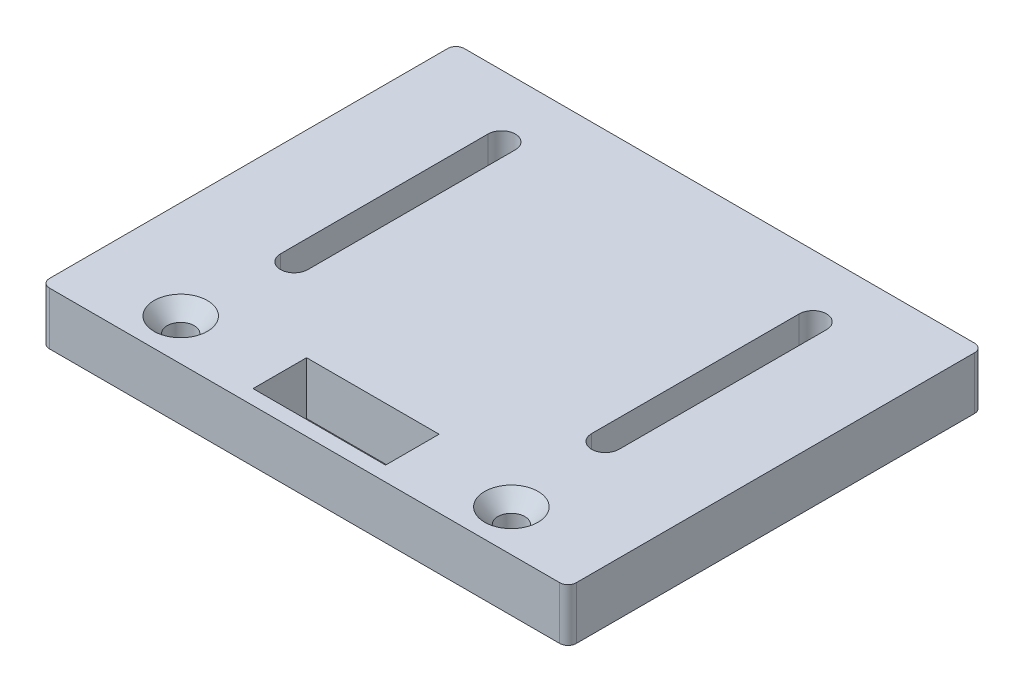
ISO-10303-21;
HEADER;
FILE_DESCRIPTION(('STEP AP214'),'2;1');
FILE_NAME('part.step','',(''),(''),'','','');
FILE_SCHEMA(('AUTOMOTIVE_DESIGN { 1 0 10303 214 1 1 1 1 }'));
ENDSEC;
DATA;
#1=APPLICATION_CONTEXT('core data for automotive mechanical design processes');
#2=APPLICATION_PROTOCOL_DEFINITION('international standard','automotive_design',2000,#1);
#3=PRODUCT_CONTEXT('',#1,'mechanical');
#4=PRODUCT('Part','Part','',(#3));
#5=PRODUCT_RELATED_PRODUCT_CATEGORY('part','',(#4));
#6=PRODUCT_DEFINITION_FORMATION('','',#4);
#7=PRODUCT_DEFINITION_CONTEXT('part definition',#1,'design');
#8=PRODUCT_DEFINITION('design','',#6,#7);
#9=PRODUCT_DEFINITION_SHAPE('','',#8);
#10=(LENGTH_UNIT() NAMED_UNIT(*) SI_UNIT(.MILLI.,.METRE.));
#11=(NAMED_UNIT(*) PLANE_ANGLE_UNIT() SI_UNIT($,.RADIAN.));
#12=(NAMED_UNIT(*) SI_UNIT($,.STERADIAN.) SOLID_ANGLE_UNIT());
#13=UNCERTAINTY_MEASURE_WITH_UNIT(LENGTH_MEASURE(1.E-05),#10,'distance_accuracy_value','');
#14=(GEOMETRIC_REPRESENTATION_CONTEXT(3) GLOBAL_UNCERTAINTY_ASSIGNED_CONTEXT((#13)) GLOBAL_UNIT_ASSIGNED_CONTEXT((#10,
#11,#12)) REPRESENTATION_CONTEXT('',''));
#15=CARTESIAN_POINT('',(0.,0.,0.));
#16=DIRECTION('',(0.,0.,1.));
#17=DIRECTION('',(1.,0.,0.));
#18=AXIS2_PLACEMENT_3D('',#15,#16,#17);
#19=CARTESIAN_POINT('',(0.,12.7,0.));
#20=DIRECTION('',(1.,0.,0.));
#21=DIRECTION('',(0.,0.,-1.));
#22=AXIS2_PLACEMENT_3D('',#19,#20,#21);
#23=PLANE('',#22);
#24=DIRECTION('',(0.,0.,1.));
#25=VECTOR('',#24,1.);
#26=CARTESIAN_POINT('',(0.,0.,0.));
#27=LINE('',#26,#25);
#28=CARTESIAN_POINT('',(0.,0.,-98.));
#29=VERTEX_POINT('',#28);
#30=CARTESIAN_POINT('',(0.,0.,-2.));
#31=VERTEX_POINT('',#30);
#32=EDGE_CURVE('E275',#29,#31,#27,.T.);
#33=ORIENTED_EDGE('',*,*,#32,.T.);
#34=DIRECTION('',(0.,-1.,0.));
#35=VECTOR('',#34,1.);
#36=CARTESIAN_POINT('',(0.,12.7,-2.));
#37=LINE('',#36,#35);
#38=CARTESIAN_POINT('',(0.,12.7,-2.));
#39=VERTEX_POINT('',#38);
#40=EDGE_CURVE('E11',#31,#39,#37,.F.);
#41=ORIENTED_EDGE('',*,*,#40,.T.);
#42=DIRECTION('',(0.,0.,1.));
#43=VECTOR('',#42,1.);
#44=CARTESIAN_POINT('',(0.,12.7,0.));
#45=LINE('',#44,#43);
#46=CARTESIAN_POINT('',(0.,12.7,-98.));
#47=VERTEX_POINT('',#46);
#48=EDGE_CURVE('E281',#47,#39,#45,.T.);
#49=ORIENTED_EDGE('',*,*,#48,.F.);
#50=DIRECTION('',(0.,-1.,0.));
#51=VECTOR('',#50,1.);
#52=CARTESIAN_POINT('',(0.,12.7,-98.));
#53=LINE('',#52,#51);
#54=EDGE_CURVE('E40',#47,#29,#53,.T.);
#55=ORIENTED_EDGE('',*,*,#54,.T.);
#56=EDGE_LOOP('',(#33,#41,#49,#55));
#57=FACE_BOUND('',#56,.T.);
#58=ADVANCED_FACE('F32',(#57),#23,.F.);
#59=CARTESIAN_POINT('',(0.,12.7,0.));
#60=DIRECTION('',(0.,0.,-1.));
#61=DIRECTION('',(-1.,0.,0.));
#62=AXIS2_PLACEMENT_3D('',#59,#60,#61);
#63=PLANE('',#62);
#64=DIRECTION('',(1.,0.,0.));
#65=VECTOR('',#64,1.);
#66=CARTESIAN_POINT('',(0.,0.,0.));
#67=LINE('',#66,#65);
#68=CARTESIAN_POINT('',(2.,0.,0.));
#69=VERTEX_POINT('',#68);
#70=CARTESIAN_POINT('',(125.,0.,0.));
#71=VERTEX_POINT('',#70);
#72=EDGE_CURVE('E295',#69,#71,#67,.T.);
#73=ORIENTED_EDGE('',*,*,#72,.T.);
#74=DIRECTION('',(0.,-1.,0.));
#75=VECTOR('',#74,1.);
#76=CARTESIAN_POINT('',(125.,12.7,0.));
#77=LINE('',#76,#75);
#78=CARTESIAN_POINT('',(125.,12.7,0.));
#79=VERTEX_POINT('',#78);
#80=EDGE_CURVE('E47',#71,#79,#77,.F.);
#81=ORIENTED_EDGE('',*,*,#80,.T.);
#82=DIRECTION('',(1.,0.,0.));
#83=VECTOR('',#82,1.);
#84=CARTESIAN_POINT('',(0.,12.7,0.));
#85=LINE('',#84,#83);
#86=CARTESIAN_POINT('',(2.,12.7,0.));
#87=VERTEX_POINT('',#86);
#88=EDGE_CURVE('E283',#87,#79,#85,.T.);
#89=ORIENTED_EDGE('',*,*,#88,.F.);
#90=DIRECTION('',(0.,-1.,0.));
#91=VECTOR('',#90,1.);
#92=CARTESIAN_POINT('',(2.,12.7,0.));
#93=LINE('',#92,#91);
#94=EDGE_CURVE('E326',#87,#69,#93,.T.);
#95=ORIENTED_EDGE('',*,*,#94,.T.);
#96=EDGE_LOOP('',(#73,#81,#89,#95));
#97=FACE_BOUND('',#96,.T.);
#98=ADVANCED_FACE('F343',(#97),#63,.F.);
#99=CARTESIAN_POINT('',(127.,12.7,0.));
#100=DIRECTION('',(-1.,0.,0.));
#101=DIRECTION('',(0.,0.,1.));
#102=AXIS2_PLACEMENT_3D('',#99,#100,#101);
#103=PLANE('',#102);
#104=DIRECTION('',(0.,0.,-1.));
#105=VECTOR('',#104,1.);
#106=CARTESIAN_POINT('',(127.,0.,0.));
#107=LINE('',#106,#105);
#108=CARTESIAN_POINT('',(127.,0.,-2.));
#109=VERTEX_POINT('',#108);
#110=CARTESIAN_POINT('',(127.,0.,-98.));
#111=VERTEX_POINT('',#110);
#112=EDGE_CURVE('E297',#109,#111,#107,.T.);
#113=ORIENTED_EDGE('',*,*,#112,.T.);
#114=DIRECTION('',(0.,-1.,0.));
#115=VECTOR('',#114,1.);
#116=CARTESIAN_POINT('',(127.,12.7,-98.));
#117=LINE('',#116,#115);
#118=CARTESIAN_POINT('',(127.,12.7,-98.));
#119=VERTEX_POINT('',#118);
#120=EDGE_CURVE('E317',#111,#119,#117,.F.);
#121=ORIENTED_EDGE('',*,*,#120,.T.);
#122=DIRECTION('',(0.,0.,-1.));
#123=VECTOR('',#122,1.);
#124=CARTESIAN_POINT('',(127.,12.7,0.));
#125=LINE('',#124,#123);
#126=CARTESIAN_POINT('',(127.,12.7,-2.));
#127=VERTEX_POINT('',#126);
#128=EDGE_CURVE('E286',#127,#119,#125,.T.);
#129=ORIENTED_EDGE('',*,*,#128,.F.);
#130=DIRECTION('',(0.,-1.,0.));
#131=VECTOR('',#130,1.);
#132=CARTESIAN_POINT('',(127.,12.7,-2.));
#133=LINE('',#132,#131);
#134=EDGE_CURVE('E314',#127,#109,#133,.T.);
#135=ORIENTED_EDGE('',*,*,#134,.T.);
#136=EDGE_LOOP('',(#113,#121,#129,#135));
#137=FACE_BOUND('',#136,.T.);
#138=ADVANCED_FACE('F352',(#137),#103,.F.);
#139=CARTESIAN_POINT('',(0.,12.7,-100.));
#140=DIRECTION('',(0.,0.,1.));
#141=DIRECTION('',(1.,0.,0.));
#142=AXIS2_PLACEMENT_3D('',#139,#140,#141);
#143=PLANE('',#142);
#144=DIRECTION('',(-1.,0.,0.));
#145=VECTOR('',#144,1.);
#146=CARTESIAN_POINT('',(0.,12.7,-100.));
#147=LINE('',#146,#145);
#148=CARTESIAN_POINT('',(125.,12.7,-100.));
#149=VERTEX_POINT('',#148);
#150=CARTESIAN_POINT('',(2.,12.7,-100.));
#151=VERTEX_POINT('',#150);
#152=EDGE_CURVE('E289',#149,#151,#147,.T.);
#153=ORIENTED_EDGE('',*,*,#152,.F.);
#154=DIRECTION('',(0.,-1.,0.));
#155=VECTOR('',#154,1.);
#156=CARTESIAN_POINT('',(125.,12.7,-100.));
#157=LINE('',#156,#155);
#158=CARTESIAN_POINT('',(125.,0.,-100.));
#159=VERTEX_POINT('',#158);
#160=EDGE_CURVE('E303',#149,#159,#157,.T.);
#161=ORIENTED_EDGE('',*,*,#160,.T.);
#162=DIRECTION('',(-1.,0.,0.));
#163=VECTOR('',#162,1.);
#164=CARTESIAN_POINT('',(0.,0.,-100.));
#165=LINE('',#164,#163);
#166=CARTESIAN_POINT('',(2.,0.,-100.));
#167=VERTEX_POINT('',#166);
#168=EDGE_CURVE('E284',#159,#167,#165,.T.);
#169=ORIENTED_EDGE('',*,*,#168,.T.);
#170=DIRECTION('',(0.,-1.,0.));
#171=VECTOR('',#170,1.);
#172=CARTESIAN_POINT('',(2.,12.7,-100.));
#173=LINE('',#172,#171);
#174=EDGE_CURVE('E292',#167,#151,#173,.F.);
#175=ORIENTED_EDGE('',*,*,#174,.T.);
#176=EDGE_LOOP('',(#153,#161,#169,#175));
#177=FACE_BOUND('',#176,.T.);
#178=ADVANCED_FACE('F360',(#177),#143,.F.);
#179=CARTESIAN_POINT('',(0.,12.7,0.));
#180=DIRECTION('',(0.,-1.,0.));
#181=DIRECTION('',(0.,0.,-1.));
#182=AXIS2_PLACEMENT_3D('',#179,#180,#181);
#183=PLANE('',#182);
#184=CARTESIAN_POINT('',(23.65,12.7,-9.99689239735138));
#185=DIRECTION('',(0.,1.,0.));
#186=DIRECTION('',(0.,0.,1.));
#187=AXIS2_PLACEMENT_3D('',#184,#185,#186);
#188=CIRCLE('',#187,6.4389);
#189=CARTESIAN_POINT('',(23.65,12.7,-3.55799239735138));
#190=VERTEX_POINT('',#189);
#191=EDGE_CURVE('E632',#190,#190,#188,.T.);
#192=ORIENTED_EDGE('',*,*,#191,.F.);
#193=EDGE_LOOP('',(#192));
#194=FACE_BOUND('',#193,.T.);
#195=CARTESIAN_POINT('',(103.35,12.7,-9.99689239735138));
#196=DIRECTION('',(0.,1.,0.));
#197=DIRECTION('',(0.,0.,1.));
#198=AXIS2_PLACEMENT_3D('',#195,#196,#197);
#199=CIRCLE('',#198,6.4389);
#200=CARTESIAN_POINT('',(103.35,12.7,-3.55799239735138));
#201=VERTEX_POINT('',#200);
#202=EDGE_CURVE('E639',#201,#201,#199,.T.);
#203=ORIENTED_EDGE('',*,*,#202,.F.);
#204=EDGE_LOOP('',(#203));
#205=FACE_BOUND('',#204,.T.);
#206=DIRECTION('',(-0.000607902679401196,0.,0.999999815227149));
#207=VECTOR('',#206,1.);
#208=CARTESIAN_POINT('',(97.7212702745475,12.7,-34.9792032613147));
#209=LINE('',#208,#207);
#210=CARTESIAN_POINT('',(97.7516654085176,12.7,-84.9791940226721));
#211=VERTEX_POINT('',#210);
#212=CARTESIAN_POINT('',(97.7212702745475,12.7,-34.9792032613147));
#213=VERTEX_POINT('',#212);
#214=EDGE_CURVE('E207',#211,#213,#209,.T.);
#215=ORIENTED_EDGE('',*,*,#214,.F.);
#216=CARTESIAN_POINT('',(101.051664798767,12.7,-84.9771879438301));
#217=DIRECTION('',(0.,1.,0.));
#218=DIRECTION('',(0.,0.,-1.));
#219=AXIS2_PLACEMENT_3D('',#216,#217,#218);
#220=CIRCLE('',#219,3.3);
#221=CARTESIAN_POINT('',(104.351664189017,12.7,-84.9751818649881));
#222=VERTEX_POINT('',#221);
#223=EDGE_CURVE('E177',#222,#211,#220,.T.);
#224=ORIENTED_EDGE('',*,*,#223,.F.);
#225=DIRECTION('',(0.000607902679400918,0.,-0.999999815227149));
#226=VECTOR('',#225,1.);
#227=CARTESIAN_POINT('',(104.321269055047,12.7,-34.9751911036306));
#228=LINE('',#227,#226);
#229=CARTESIAN_POINT('',(104.321269055047,12.7,-34.9751911036306));
#230=VERTEX_POINT('',#229);
#231=EDGE_CURVE('E195',#230,#222,#228,.T.);
#232=ORIENTED_EDGE('',*,*,#231,.F.);
#233=CARTESIAN_POINT('',(101.021269664797,12.7,-34.9771971824727));
#234=DIRECTION('',(0.,1.,0.));
#235=DIRECTION('',(0.,0.,-1.));
#236=AXIS2_PLACEMENT_3D('',#233,#234,#235);
#237=CIRCLE('',#236,3.3);
#238=EDGE_CURVE('E198',#213,#230,#237,.T.);
#239=ORIENTED_EDGE('',*,*,#238,.F.);
#240=EDGE_LOOP('',(#215,#224,#232,#239));
#241=FACE_BOUND('',#240,.T.);
#242=DIRECTION('',(0.,0.,-1.));
#243=VECTOR('',#242,1.);
#244=CARTESIAN_POINT('',(29.3,12.7,-35.));
#245=LINE('',#244,#243);
#246=CARTESIAN_POINT('',(29.3,12.7,-35.));
#247=VERTEX_POINT('',#246);
#248=CARTESIAN_POINT('',(29.3,12.7,-85.));
#249=VERTEX_POINT('',#248);
#250=EDGE_CURVE('E234',#247,#249,#245,.T.);
#251=ORIENTED_EDGE('',*,*,#250,.F.);
#252=CARTESIAN_POINT('',(26.,12.7,-35.));
#253=DIRECTION('',(0.,1.,0.));
#254=DIRECTION('',(0.,0.,1.));
#255=AXIS2_PLACEMENT_3D('',#252,#253,#254);
#256=CIRCLE('',#255,3.3);
#257=CARTESIAN_POINT('',(22.7,12.7,-35.));
#258=VERTEX_POINT('',#257);
#259=EDGE_CURVE('E232',#258,#247,#256,.T.);
#260=ORIENTED_EDGE('',*,*,#259,.F.);
#261=DIRECTION('',(0.,0.,1.));
#262=VECTOR('',#261,1.);
#263=CARTESIAN_POINT('',(22.7,12.7,-35.));
#264=LINE('',#263,#262);
#265=CARTESIAN_POINT('',(22.7,12.7,-85.));
#266=VERTEX_POINT('',#265);
#267=EDGE_CURVE('E222',#266,#258,#264,.T.);
#268=ORIENTED_EDGE('',*,*,#267,.F.);
#269=CARTESIAN_POINT('',(26.,12.7,-85.));
#270=DIRECTION('',(0.,1.,0.));
#271=DIRECTION('',(0.,0.,1.));
#272=AXIS2_PLACEMENT_3D('',#269,#270,#271);
#273=CIRCLE('',#272,3.3);
#274=EDGE_CURVE('E237',#249,#266,#273,.T.);
#275=ORIENTED_EDGE('',*,*,#274,.F.);
#276=EDGE_LOOP('',(#251,#260,#268,#275));
#277=FACE_BOUND('',#276,.T.);
#278=DIRECTION('',(1.,0.,0.));
#279=VECTOR('',#278,1.);
#280=CARTESIAN_POINT('',(47.53,12.7,-3.55));
#281=LINE('',#280,#279);
#282=CARTESIAN_POINT('',(47.53,12.7,-3.55));
#283=VERTEX_POINT('',#282);
#284=CARTESIAN_POINT('',(79.48,12.7,-3.55));
#285=VERTEX_POINT('',#284);
#286=EDGE_CURVE('E214',#283,#285,#281,.T.);
#287=ORIENTED_EDGE('',*,*,#286,.F.);
#288=DIRECTION('',(0.,0.,1.));
#289=VECTOR('',#288,1.);
#290=CARTESIAN_POINT('',(47.53,12.7,-10.));
#291=LINE('',#290,#289);
#292=CARTESIAN_POINT('',(47.53,12.7,-16.45));
#293=VERTEX_POINT('',#292);
#294=EDGE_CURVE('E253',#293,#283,#291,.T.);
#295=ORIENTED_EDGE('',*,*,#294,.F.);
#296=DIRECTION('',(-1.,0.,0.));
#297=VECTOR('',#296,1.);
#298=CARTESIAN_POINT('',(47.53,12.7,-16.45));
#299=LINE('',#298,#297);
#300=CARTESIAN_POINT('',(79.48,12.7,-16.45));
#301=VERTEX_POINT('',#300);
#302=EDGE_CURVE('E268',#301,#293,#299,.T.);
#303=ORIENTED_EDGE('',*,*,#302,.F.);
#304=DIRECTION('',(0.,0.,-1.));
#305=VECTOR('',#304,1.);
#306=CARTESIAN_POINT('',(79.48,12.7,-10.));
#307=LINE('',#306,#305);
#308=EDGE_CURVE('E265',#285,#301,#307,.T.);
#309=ORIENTED_EDGE('',*,*,#308,.F.);
#310=EDGE_LOOP('',(#287,#295,#303,#309));
#311=FACE_BOUND('',#310,.T.);
#312=ORIENTED_EDGE('',*,*,#128,.T.);
#313=CARTESIAN_POINT('',(125.,12.7,-98.));
#314=DIRECTION('',(0.,-1.,0.));
#315=DIRECTION('',(0.,0.,-1.));
#316=AXIS2_PLACEMENT_3D('',#313,#314,#315);
#317=CIRCLE('',#316,2.);
#318=EDGE_CURVE('E324',#119,#149,#317,.F.);
#319=ORIENTED_EDGE('',*,*,#318,.T.);
#320=ORIENTED_EDGE('',*,*,#152,.T.);
#321=CARTESIAN_POINT('',(2.,12.7,-98.));
#322=DIRECTION('',(0.,-1.,0.));
#323=DIRECTION('',(0.,0.,-1.));
#324=AXIS2_PLACEMENT_3D('',#321,#322,#323);
#325=CIRCLE('',#324,2.);
#326=EDGE_CURVE('E319',#151,#47,#325,.F.);
#327=ORIENTED_EDGE('',*,*,#326,.T.);
#328=ORIENTED_EDGE('',*,*,#48,.T.);
#329=CARTESIAN_POINT('',(2.,12.7,-2.));
#330=DIRECTION('',(0.,-1.,0.));
#331=DIRECTION('',(0.,0.,-1.));
#332=AXIS2_PLACEMENT_3D('',#329,#330,#331);
#333=CIRCLE('',#332,2.);
#334=EDGE_CURVE('E54',#39,#87,#333,.F.);
#335=ORIENTED_EDGE('',*,*,#334,.T.);
#336=ORIENTED_EDGE('',*,*,#88,.T.);
#337=CARTESIAN_POINT('',(125.,12.7,-2.));
#338=DIRECTION('',(0.,-1.,0.));
#339=DIRECTION('',(0.,0.,-1.));
#340=AXIS2_PLACEMENT_3D('',#337,#338,#339);
#341=CIRCLE('',#340,2.);
#342=EDGE_CURVE('E322',#79,#127,#341,.F.);
#343=ORIENTED_EDGE('',*,*,#342,.T.);
#344=EDGE_LOOP('',(#312,#319,#320,#327,#328,#335,#336,#343));
#345=FACE_BOUND('',#344,.T.);
#346=ADVANCED_FACE('F345',(#194,#205,#241,#277,#311,#345),#183,.F.);
#347=CARTESIAN_POINT('',(0.,0.,0.));
#348=DIRECTION('',(0.,-1.,0.));
#349=DIRECTION('',(0.,0.,-1.));
#350=AXIS2_PLACEMENT_3D('',#347,#348,#349);
#351=PLANE('',#350);
#352=CARTESIAN_POINT('',(23.65,0.,-9.99689239735138));
#353=DIRECTION('',(0.,1.,0.));
#354=DIRECTION('',(0.,0.,1.));
#355=AXIS2_PLACEMENT_3D('',#352,#353,#354);
#356=CIRCLE('',#355,3.26389999999999);
#357=CARTESIAN_POINT('',(23.65,0.,-6.73299239735139));
#358=VERTEX_POINT('',#357);
#359=EDGE_CURVE('E634',#358,#358,#356,.T.);
#360=ORIENTED_EDGE('',*,*,#359,.T.);
#361=EDGE_LOOP('',(#360));
#362=FACE_BOUND('',#361,.T.);
#363=CARTESIAN_POINT('',(103.35,0.,-9.99689239735138));
#364=DIRECTION('',(0.,1.,0.));
#365=DIRECTION('',(0.,0.,1.));
#366=AXIS2_PLACEMENT_3D('',#363,#364,#365);
#367=CIRCLE('',#366,3.26389999999999);
#368=CARTESIAN_POINT('',(103.35,0.,-6.73299239735139));
#369=VERTEX_POINT('',#368);
#370=EDGE_CURVE('E201',#369,#369,#367,.T.);
#371=ORIENTED_EDGE('',*,*,#370,.T.);
#372=EDGE_LOOP('',(#371));
#373=FACE_BOUND('',#372,.T.);
#374=CARTESIAN_POINT('',(101.051664798767,0.,-84.9771879438301));
#375=DIRECTION('',(0.,1.,0.));
#376=DIRECTION('',(0.,0.,-1.));
#377=AXIS2_PLACEMENT_3D('',#374,#375,#376);
#378=CIRCLE('',#377,3.3);
#379=CARTESIAN_POINT('',(104.351664189017,0.,-84.9751818649881));
#380=VERTEX_POINT('',#379);
#381=CARTESIAN_POINT('',(97.7516654085176,0.,-84.9791940226721));
#382=VERTEX_POINT('',#381);
#383=EDGE_CURVE('E174',#380,#382,#378,.T.);
#384=ORIENTED_EDGE('',*,*,#383,.T.);
#385=DIRECTION('',(-0.000607902679401196,0.,0.999999815227149));
#386=VECTOR('',#385,1.);
#387=CARTESIAN_POINT('',(97.7212702745475,0.,-34.9792032613147));
#388=LINE('',#387,#386);
#389=CARTESIAN_POINT('',(97.7212702745475,0.,-34.9792032613147));
#390=VERTEX_POINT('',#389);
#391=EDGE_CURVE('E186',#382,#390,#388,.T.);
#392=ORIENTED_EDGE('',*,*,#391,.T.);
#393=CARTESIAN_POINT('',(101.021269664797,0.,-34.9771971824727));
#394=DIRECTION('',(0.,1.,0.));
#395=DIRECTION('',(0.,0.,-1.));
#396=AXIS2_PLACEMENT_3D('',#393,#394,#395);
#397=CIRCLE('',#396,3.3);
#398=CARTESIAN_POINT('',(104.321269055047,0.,-34.9751911036306));
#399=VERTEX_POINT('',#398);
#400=EDGE_CURVE('E190',#390,#399,#397,.T.);
#401=ORIENTED_EDGE('',*,*,#400,.T.);
#402=DIRECTION('',(0.000607902679400918,0.,-0.999999815227149));
#403=VECTOR('',#402,1.);
#404=CARTESIAN_POINT('',(104.321269055047,0.,-34.9751911036306));
#405=LINE('',#404,#403);
#406=EDGE_CURVE('E182',#399,#380,#405,.T.);
#407=ORIENTED_EDGE('',*,*,#406,.T.);
#408=EDGE_LOOP('',(#384,#392,#401,#407));
#409=FACE_BOUND('',#408,.T.);
#410=CARTESIAN_POINT('',(26.,0.,-35.));
#411=DIRECTION('',(0.,1.,0.));
#412=DIRECTION('',(0.,0.,1.));
#413=AXIS2_PLACEMENT_3D('',#410,#411,#412);
#414=CIRCLE('',#413,3.3);
#415=CARTESIAN_POINT('',(22.7,0.,-35.));
#416=VERTEX_POINT('',#415);
#417=CARTESIAN_POINT('',(29.3,0.,-35.));
#418=VERTEX_POINT('',#417);
#419=EDGE_CURVE('E218',#416,#418,#414,.T.);
#420=ORIENTED_EDGE('',*,*,#419,.T.);
#421=DIRECTION('',(0.,0.,-1.));
#422=VECTOR('',#421,1.);
#423=CARTESIAN_POINT('',(29.3,0.,-35.));
#424=LINE('',#423,#422);
#425=CARTESIAN_POINT('',(29.3,0.,-85.));
#426=VERTEX_POINT('',#425);
#427=EDGE_CURVE('E221',#418,#426,#424,.T.);
#428=ORIENTED_EDGE('',*,*,#427,.T.);
#429=CARTESIAN_POINT('',(26.,0.,-85.));
#430=DIRECTION('',(0.,1.,0.));
#431=DIRECTION('',(0.,0.,1.));
#432=AXIS2_PLACEMENT_3D('',#429,#430,#431);
#433=CIRCLE('',#432,3.3);
#434=CARTESIAN_POINT('',(22.7,0.,-85.));
#435=VERTEX_POINT('',#434);
#436=EDGE_CURVE('E225',#426,#435,#433,.T.);
#437=ORIENTED_EDGE('',*,*,#436,.T.);
#438=DIRECTION('',(0.,0.,1.));
#439=VECTOR('',#438,1.);
#440=CARTESIAN_POINT('',(22.7,0.,-35.));
#441=LINE('',#440,#439);
#442=EDGE_CURVE('E228',#435,#416,#441,.T.);
#443=ORIENTED_EDGE('',*,*,#442,.T.);
#444=EDGE_LOOP('',(#420,#428,#437,#443));
#445=FACE_BOUND('',#444,.T.);
#446=DIRECTION('',(0.,0.,1.));
#447=VECTOR('',#446,1.);
#448=CARTESIAN_POINT('',(47.53,0.,-10.));
#449=LINE('',#448,#447);
#450=CARTESIAN_POINT('',(47.53,0.,-16.45));
#451=VERTEX_POINT('',#450);
#452=CARTESIAN_POINT('',(47.53,0.,-3.55));
#453=VERTEX_POINT('',#452);
#454=EDGE_CURVE('E249',#451,#453,#449,.T.);
#455=ORIENTED_EDGE('',*,*,#454,.T.);
#456=DIRECTION('',(1.,0.,0.));
#457=VECTOR('',#456,1.);
#458=CARTESIAN_POINT('',(47.53,0.,-3.55));
#459=LINE('',#458,#457);
#460=CARTESIAN_POINT('',(79.48,0.,-3.55));
#461=VERTEX_POINT('',#460);
#462=EDGE_CURVE('E252',#453,#461,#459,.T.);
#463=ORIENTED_EDGE('',*,*,#462,.T.);
#464=DIRECTION('',(0.,0.,-1.));
#465=VECTOR('',#464,1.);
#466=CARTESIAN_POINT('',(79.48,0.,-3.55));
#467=LINE('',#466,#465);
#468=CARTESIAN_POINT('',(79.48,0.,-16.45));
#469=VERTEX_POINT('',#468);
#470=EDGE_CURVE('E256',#461,#469,#467,.T.);
#471=ORIENTED_EDGE('',*,*,#470,.T.);
#472=DIRECTION('',(-1.,0.,0.));
#473=VECTOR('',#472,1.);
#474=CARTESIAN_POINT('',(47.53,0.,-16.45));
#475=LINE('',#474,#473);
#476=EDGE_CURVE('E259',#469,#451,#475,.T.);
#477=ORIENTED_EDGE('',*,*,#476,.T.);
#478=EDGE_LOOP('',(#455,#463,#471,#477));
#479=FACE_BOUND('',#478,.T.);
#480=ORIENTED_EDGE('',*,*,#168,.F.);
#481=CARTESIAN_POINT('',(125.,0.,-98.));
#482=DIRECTION('',(0.,-1.,0.));
#483=DIRECTION('',(0.,0.,-1.));
#484=AXIS2_PLACEMENT_3D('',#481,#482,#483);
#485=CIRCLE('',#484,2.);
#486=EDGE_CURVE('E312',#159,#111,#485,.T.);
#487=ORIENTED_EDGE('',*,*,#486,.T.);
#488=ORIENTED_EDGE('',*,*,#112,.F.);
#489=CARTESIAN_POINT('',(125.,0.,-2.));
#490=DIRECTION('',(0.,-1.,0.));
#491=DIRECTION('',(0.,0.,-1.));
#492=AXIS2_PLACEMENT_3D('',#489,#490,#491);
#493=CIRCLE('',#492,2.);
#494=EDGE_CURVE('E310',#109,#71,#493,.T.);
#495=ORIENTED_EDGE('',*,*,#494,.T.);
#496=ORIENTED_EDGE('',*,*,#72,.F.);
#497=CARTESIAN_POINT('',(2.,0.,-2.));
#498=DIRECTION('',(0.,-1.,0.));
#499=DIRECTION('',(0.,0.,-1.));
#500=AXIS2_PLACEMENT_3D('',#497,#498,#499);
#501=CIRCLE('',#500,2.);
#502=EDGE_CURVE('E308',#69,#31,#501,.T.);
#503=ORIENTED_EDGE('',*,*,#502,.T.);
#504=ORIENTED_EDGE('',*,*,#32,.F.);
#505=CARTESIAN_POINT('',(2.,0.,-98.));
#506=DIRECTION('',(0.,-1.,0.));
#507=DIRECTION('',(0.,0.,-1.));
#508=AXIS2_PLACEMENT_3D('',#505,#506,#507);
#509=CIRCLE('',#508,2.);
#510=EDGE_CURVE('E306',#29,#167,#509,.T.);
#511=ORIENTED_EDGE('',*,*,#510,.T.);
#512=EDGE_LOOP('',(#480,#487,#488,#495,#496,#503,#504,#511));
#513=FACE_BOUND('',#512,.T.);
#514=ADVANCED_FACE('F192',(#362,#373,#409,#445,#479,#513),#351,.T.);
#515=CARTESIAN_POINT('',(47.53,0.,-10.));
#516=DIRECTION('',(-1.,0.,0.));
#517=DIRECTION('',(0.,0.,1.));
#518=AXIS2_PLACEMENT_3D('',#515,#516,#517);
#519=PLANE('',#518);
#520=ORIENTED_EDGE('',*,*,#294,.T.);
#521=DIRECTION('',(0.,1.,0.));
#522=VECTOR('',#521,1.);
#523=CARTESIAN_POINT('',(47.53,0.,-3.55));
#524=LINE('',#523,#522);
#525=EDGE_CURVE('E262',#453,#283,#524,.T.);
#526=ORIENTED_EDGE('',*,*,#525,.F.);
#527=ORIENTED_EDGE('',*,*,#454,.F.);
#528=DIRECTION('',(0.,1.,0.));
#529=VECTOR('',#528,1.);
#530=CARTESIAN_POINT('',(47.53,0.,-16.45));
#531=LINE('',#530,#529);
#532=EDGE_CURVE('E273',#451,#293,#531,.T.);
#533=ORIENTED_EDGE('',*,*,#532,.T.);
#534=EDGE_LOOP('',(#520,#526,#527,#533));
#535=FACE_BOUND('',#534,.T.);
#536=ADVANCED_FACE('F416',(#535),#519,.F.);
#537=CARTESIAN_POINT('',(47.53,0.,-16.45));
#538=DIRECTION('',(0.,0.,-1.));
#539=DIRECTION('',(-1.,0.,0.));
#540=AXIS2_PLACEMENT_3D('',#537,#538,#539);
#541=PLANE('',#540);
#542=ORIENTED_EDGE('',*,*,#302,.T.);
#543=ORIENTED_EDGE('',*,*,#532,.F.);
#544=ORIENTED_EDGE('',*,*,#476,.F.);
#545=DIRECTION('',(0.,1.,0.));
#546=VECTOR('',#545,1.);
#547=CARTESIAN_POINT('',(79.48,0.,-16.45));
#548=LINE('',#547,#546);
#549=EDGE_CURVE('E276',#469,#301,#548,.T.);
#550=ORIENTED_EDGE('',*,*,#549,.T.);
#551=EDGE_LOOP('',(#542,#543,#544,#550));
#552=FACE_BOUND('',#551,.T.);
#553=ADVANCED_FACE('F489',(#552),#541,.F.);
#554=CARTESIAN_POINT('',(79.48,0.,-10.));
#555=DIRECTION('',(1.,0.,0.));
#556=DIRECTION('',(0.,0.,-1.));
#557=AXIS2_PLACEMENT_3D('',#554,#555,#556);
#558=PLANE('',#557);
#559=ORIENTED_EDGE('',*,*,#308,.T.);
#560=ORIENTED_EDGE('',*,*,#549,.F.);
#561=ORIENTED_EDGE('',*,*,#470,.F.);
#562=DIRECTION('',(0.,1.,0.));
#563=VECTOR('',#562,1.);
#564=CARTESIAN_POINT('',(79.48,0.,-3.55));
#565=LINE('',#564,#563);
#566=EDGE_CURVE('E278',#461,#285,#565,.T.);
#567=ORIENTED_EDGE('',*,*,#566,.T.);
#568=EDGE_LOOP('',(#559,#560,#561,#567));
#569=FACE_BOUND('',#568,.T.);
#570=ADVANCED_FACE('F493',(#569),#558,.F.);
#571=CARTESIAN_POINT('',(47.53,0.,-3.55));
#572=DIRECTION('',(0.,0.,1.));
#573=DIRECTION('',(1.,0.,0.));
#574=AXIS2_PLACEMENT_3D('',#571,#572,#573);
#575=PLANE('',#574);
#576=ORIENTED_EDGE('',*,*,#286,.T.);
#577=ORIENTED_EDGE('',*,*,#566,.F.);
#578=ORIENTED_EDGE('',*,*,#462,.F.);
#579=ORIENTED_EDGE('',*,*,#525,.T.);
#580=EDGE_LOOP('',(#576,#577,#578,#579));
#581=FACE_BOUND('',#580,.T.);
#582=ADVANCED_FACE('F486',(#581),#575,.F.);
#583=CARTESIAN_POINT('',(26.,0.,-35.));
#584=DIRECTION('',(0.,1.,0.));
#585=DIRECTION('',(0.,0.,1.));
#586=AXIS2_PLACEMENT_3D('',#583,#584,#585);
#587=CYLINDRICAL_SURFACE('',#586,3.3);
#588=ORIENTED_EDGE('',*,*,#259,.T.);
#589=DIRECTION('',(0.,1.,0.));
#590=VECTOR('',#589,1.);
#591=CARTESIAN_POINT('',(29.3,0.,-35.));
#592=LINE('',#591,#590);
#593=EDGE_CURVE('E231',#418,#247,#592,.T.);
#594=ORIENTED_EDGE('',*,*,#593,.F.);
#595=ORIENTED_EDGE('',*,*,#419,.F.);
#596=DIRECTION('',(0.,1.,0.));
#597=VECTOR('',#596,1.);
#598=CARTESIAN_POINT('',(22.7,0.,-35.));
#599=LINE('',#598,#597);
#600=EDGE_CURVE('E208',#416,#258,#599,.T.);
#601=ORIENTED_EDGE('',*,*,#600,.T.);
#602=EDGE_LOOP('',(#588,#594,#595,#601));
#603=FACE_BOUND('',#602,.T.);
#604=ADVANCED_FACE('F476',(#603),#587,.F.);
#605=CARTESIAN_POINT('',(22.7,0.,-35.));
#606=DIRECTION('',(-1.,0.,0.));
#607=DIRECTION('',(0.,0.,1.));
#608=AXIS2_PLACEMENT_3D('',#605,#606,#607);
#609=PLANE('',#608);
#610=ORIENTED_EDGE('',*,*,#267,.T.);
#611=ORIENTED_EDGE('',*,*,#600,.F.);
#612=ORIENTED_EDGE('',*,*,#442,.F.);
#613=DIRECTION('',(0.,1.,0.));
#614=VECTOR('',#613,1.);
#615=CARTESIAN_POINT('',(22.7,0.,-85.));
#616=LINE('',#615,#614);
#617=EDGE_CURVE('E243',#435,#266,#616,.T.);
#618=ORIENTED_EDGE('',*,*,#617,.T.);
#619=EDGE_LOOP('',(#610,#611,#612,#618));
#620=FACE_BOUND('',#619,.T.);
#621=ADVANCED_FACE('F472',(#620),#609,.F.);
#622=CARTESIAN_POINT('',(26.,0.,-85.));
#623=DIRECTION('',(0.,1.,0.));
#624=DIRECTION('',(0.,0.,1.));
#625=AXIS2_PLACEMENT_3D('',#622,#623,#624);
#626=CYLINDRICAL_SURFACE('',#625,3.3);
#627=ORIENTED_EDGE('',*,*,#274,.T.);
#628=ORIENTED_EDGE('',*,*,#617,.F.);
#629=ORIENTED_EDGE('',*,*,#436,.F.);
#630=DIRECTION('',(0.,1.,0.));
#631=VECTOR('',#630,1.);
#632=CARTESIAN_POINT('',(29.3,0.,-85.));
#633=LINE('',#632,#631);
#634=EDGE_CURVE('E245',#426,#249,#633,.T.);
#635=ORIENTED_EDGE('',*,*,#634,.T.);
#636=EDGE_LOOP('',(#627,#628,#629,#635));
#637=FACE_BOUND('',#636,.T.);
#638=ADVANCED_FACE('F475',(#637),#626,.F.);
#639=CARTESIAN_POINT('',(29.3,0.,-35.));
#640=DIRECTION('',(1.,0.,0.));
#641=DIRECTION('',(0.,0.,-1.));
#642=AXIS2_PLACEMENT_3D('',#639,#640,#641);
#643=PLANE('',#642);
#644=ORIENTED_EDGE('',*,*,#250,.T.);
#645=ORIENTED_EDGE('',*,*,#634,.F.);
#646=ORIENTED_EDGE('',*,*,#427,.F.);
#647=ORIENTED_EDGE('',*,*,#593,.T.);
#648=EDGE_LOOP('',(#644,#645,#646,#647));
#649=FACE_BOUND('',#648,.T.);
#650=ADVANCED_FACE('F471',(#649),#643,.F.);
#651=CARTESIAN_POINT('',(101.051664798767,0.,-84.9771879438301));
#652=DIRECTION('',(0.,1.,0.));
#653=DIRECTION('',(0.,0.,1.));
#654=AXIS2_PLACEMENT_3D('',#651,#652,#653);
#655=CYLINDRICAL_SURFACE('',#654,3.3);
#656=ORIENTED_EDGE('',*,*,#223,.T.);
#657=DIRECTION('',(0.,1.,0.));
#658=VECTOR('',#657,1.);
#659=CARTESIAN_POINT('',(97.7516654085176,0.,-84.9791940226721));
#660=LINE('',#659,#658);
#661=EDGE_CURVE('E170',#382,#211,#660,.T.);
#662=ORIENTED_EDGE('',*,*,#661,.F.);
#663=ORIENTED_EDGE('',*,*,#383,.F.);
#664=DIRECTION('',(0.,1.,0.));
#665=VECTOR('',#664,1.);
#666=CARTESIAN_POINT('',(104.351664189017,0.,-84.9751818649881));
#667=LINE('',#666,#665);
#668=EDGE_CURVE('E212',#380,#222,#667,.T.);
#669=ORIENTED_EDGE('',*,*,#668,.T.);
#670=EDGE_LOOP('',(#656,#662,#663,#669));
#671=FACE_BOUND('',#670,.T.);
#672=ADVANCED_FACE('F172',(#671),#655,.F.);
#673=CARTESIAN_POINT('',(104.321269055047,0.,-34.9751911036306));
#674=DIRECTION('',(0.999999815227149,0.,0.000607902679400918));
#675=DIRECTION('',(0.000607902679400918,0.,-0.999999815227149));
#676=AXIS2_PLACEMENT_3D('',#673,#674,#675);
#677=PLANE('',#676);
#678=ORIENTED_EDGE('',*,*,#231,.T.);
#679=ORIENTED_EDGE('',*,*,#668,.F.);
#680=ORIENTED_EDGE('',*,*,#406,.F.);
#681=DIRECTION('',(0.,1.,0.));
#682=VECTOR('',#681,1.);
#683=CARTESIAN_POINT('',(104.321269055047,0.,-34.9751911036306));
#684=LINE('',#683,#682);
#685=EDGE_CURVE('E215',#399,#230,#684,.T.);
#686=ORIENTED_EDGE('',*,*,#685,.T.);
#687=EDGE_LOOP('',(#678,#679,#680,#686));
#688=FACE_BOUND('',#687,.T.);
#689=ADVANCED_FACE('F460',(#688),#677,.F.);
#690=CARTESIAN_POINT('',(101.021269664797,0.,-34.9771971824727));
#691=DIRECTION('',(0.,1.,0.));
#692=DIRECTION('',(0.,0.,1.));
#693=AXIS2_PLACEMENT_3D('',#690,#691,#692);
#694=CYLINDRICAL_SURFACE('',#693,3.3);
#695=ORIENTED_EDGE('',*,*,#238,.T.);
#696=ORIENTED_EDGE('',*,*,#685,.F.);
#697=ORIENTED_EDGE('',*,*,#400,.F.);
#698=DIRECTION('',(0.,1.,0.));
#699=VECTOR('',#698,1.);
#700=CARTESIAN_POINT('',(97.7212702745475,0.,-34.9792032613147));
#701=LINE('',#700,#699);
#702=EDGE_CURVE('E181',#390,#213,#701,.T.);
#703=ORIENTED_EDGE('',*,*,#702,.T.);
#704=EDGE_LOOP('',(#695,#696,#697,#703));
#705=FACE_BOUND('',#704,.T.);
#706=ADVANCED_FACE('F463',(#705),#694,.F.);
#707=CARTESIAN_POINT('',(97.7212702745475,0.,-34.9792032613147));
#708=DIRECTION('',(-0.999999815227149,0.,-0.000607902679401196));
#709=DIRECTION('',(-0.000607902679401196,0.,0.999999815227149));
#710=AXIS2_PLACEMENT_3D('',#707,#708,#709);
#711=PLANE('',#710);
#712=ORIENTED_EDGE('',*,*,#214,.T.);
#713=ORIENTED_EDGE('',*,*,#702,.F.);
#714=ORIENTED_EDGE('',*,*,#391,.F.);
#715=ORIENTED_EDGE('',*,*,#661,.T.);
#716=EDGE_LOOP('',(#712,#713,#714,#715));
#717=FACE_BOUND('',#716,.T.);
#718=ADVANCED_FACE('F187',(#717),#711,.F.);
#719=CARTESIAN_POINT('',(125.,12.7,-98.));
#720=DIRECTION('',(0.,-1.,0.));
#721=DIRECTION('',(0.,0.,-1.));
#722=AXIS2_PLACEMENT_3D('',#719,#720,#721);
#723=CYLINDRICAL_SURFACE('',#722,2.);
#724=ORIENTED_EDGE('',*,*,#318,.F.);
#725=ORIENTED_EDGE('',*,*,#120,.F.);
#726=ORIENTED_EDGE('',*,*,#486,.F.);
#727=ORIENTED_EDGE('',*,*,#160,.F.);
#728=EDGE_LOOP('',(#724,#725,#726,#727));
#729=FACE_BOUND('',#728,.T.);
#730=ADVANCED_FACE('F357',(#729),#723,.T.);
#731=CARTESIAN_POINT('',(125.,12.7,-2.));
#732=DIRECTION('',(0.,-1.,0.));
#733=DIRECTION('',(0.,0.,-1.));
#734=AXIS2_PLACEMENT_3D('',#731,#732,#733);
#735=CYLINDRICAL_SURFACE('',#734,2.);
#736=ORIENTED_EDGE('',*,*,#342,.F.);
#737=ORIENTED_EDGE('',*,*,#80,.F.);
#738=ORIENTED_EDGE('',*,*,#494,.F.);
#739=ORIENTED_EDGE('',*,*,#134,.F.);
#740=EDGE_LOOP('',(#736,#737,#738,#739));
#741=FACE_BOUND('',#740,.T.);
#742=ADVANCED_FACE('F349',(#741),#735,.T.);
#743=CARTESIAN_POINT('',(2.,12.7,-2.));
#744=DIRECTION('',(0.,-1.,0.));
#745=DIRECTION('',(0.,0.,-1.));
#746=AXIS2_PLACEMENT_3D('',#743,#744,#745);
#747=CYLINDRICAL_SURFACE('',#746,2.);
#748=ORIENTED_EDGE('',*,*,#334,.F.);
#749=ORIENTED_EDGE('',*,*,#40,.F.);
#750=ORIENTED_EDGE('',*,*,#502,.F.);
#751=ORIENTED_EDGE('',*,*,#94,.F.);
#752=EDGE_LOOP('',(#748,#749,#750,#751));
#753=FACE_BOUND('',#752,.T.);
#754=ADVANCED_FACE('F342',(#753),#747,.T.);
#755=CARTESIAN_POINT('',(2.,12.7,-98.));
#756=DIRECTION('',(0.,-1.,0.));
#757=DIRECTION('',(0.,0.,-1.));
#758=AXIS2_PLACEMENT_3D('',#755,#756,#757);
#759=CYLINDRICAL_SURFACE('',#758,2.);
#760=ORIENTED_EDGE('',*,*,#326,.F.);
#761=ORIENTED_EDGE('',*,*,#174,.F.);
#762=ORIENTED_EDGE('',*,*,#510,.F.);
#763=ORIENTED_EDGE('',*,*,#54,.F.);
#764=EDGE_LOOP('',(#760,#761,#762,#763));
#765=FACE_BOUND('',#764,.T.);
#766=ADVANCED_FACE('F34',(#765),#759,.T.);
#767=CARTESIAN_POINT('',(103.35,12.7,-9.99689239735138));
#768=DIRECTION('',(0.,1.,0.));
#769=DIRECTION('',(0.,0.,1.));
#770=AXIS2_PLACEMENT_3D('',#767,#768,#769);
#771=CYLINDRICAL_SURFACE('',#770,3.26389999999999);
#772=ORIENTED_EDGE('',*,*,#370,.F.);
#773=EDGE_LOOP('',(#772));
#774=FACE_BOUND('',#773,.T.);
#775=CARTESIAN_POINT('',(103.35,9.04758030707329,-9.99689239735138));
#776=DIRECTION('',(0.,1.,0.));
#777=DIRECTION('',(0.,0.,1.));
#778=AXIS2_PLACEMENT_3D('',#775,#776,#777);
#779=CIRCLE('',#778,3.26389999999999);
#780=CARTESIAN_POINT('',(103.35,9.04758030707329,-6.73299239735139));
#781=VERTEX_POINT('',#780);
#782=EDGE_CURVE('E641',#781,#781,#779,.T.);
#783=ORIENTED_EDGE('',*,*,#782,.T.);
#784=EDGE_LOOP('',(#783));
#785=FACE_BOUND('',#784,.T.);
#786=ADVANCED_FACE('F363',(#774,#785),#771,.F.);
#787=CARTESIAN_POINT('',(103.35,12.7,-9.99689239735138));
#788=DIRECTION('',(0.,1.,0.));
#789=DIRECTION('',(0.,0.,1.));
#790=AXIS2_PLACEMENT_3D('',#787,#788,#789);
#791=CONICAL_SURFACE('',#790,6.4389,0.715584993317677);
#792=ORIENTED_EDGE('',*,*,#782,.F.);
#793=EDGE_LOOP('',(#792));
#794=FACE_BOUND('',#793,.T.);
#795=ORIENTED_EDGE('',*,*,#202,.T.);
#796=EDGE_LOOP('',(#795));
#797=FACE_BOUND('',#796,.T.);
#798=ADVANCED_FACE('F368',(#794,#797),#791,.F.);
#799=CARTESIAN_POINT('',(23.65,12.7,-9.99689239735138));
#800=DIRECTION('',(0.,1.,0.));
#801=DIRECTION('',(0.,0.,1.));
#802=AXIS2_PLACEMENT_3D('',#799,#800,#801);
#803=CYLINDRICAL_SURFACE('',#802,3.26389999999999);
#804=ORIENTED_EDGE('',*,*,#359,.F.);
#805=EDGE_LOOP('',(#804));
#806=FACE_BOUND('',#805,.T.);
#807=CARTESIAN_POINT('',(23.65,9.04758030707329,-9.99689239735138));
#808=DIRECTION('',(0.,1.,0.));
#809=DIRECTION('',(0.,0.,1.));
#810=AXIS2_PLACEMENT_3D('',#807,#808,#809);
#811=CIRCLE('',#810,3.26389999999999);
#812=CARTESIAN_POINT('',(23.65,9.04758030707329,-6.73299239735139));
#813=VERTEX_POINT('',#812);
#814=EDGE_CURVE('E629',#813,#813,#811,.T.);
#815=ORIENTED_EDGE('',*,*,#814,.T.);
#816=EDGE_LOOP('',(#815));
#817=FACE_BOUND('',#816,.T.);
#818=ADVANCED_FACE('F433',(#806,#817),#803,.F.);
#819=CARTESIAN_POINT('',(23.65,12.7,-9.99689239735138));
#820=DIRECTION('',(0.,1.,0.));
#821=DIRECTION('',(0.,0.,1.));
#822=AXIS2_PLACEMENT_3D('',#819,#820,#821);
#823=CONICAL_SURFACE('',#822,6.4389,0.715584993317677);
#824=ORIENTED_EDGE('',*,*,#814,.F.);
#825=EDGE_LOOP('',(#824));
#826=FACE_BOUND('',#825,.T.);
#827=ORIENTED_EDGE('',*,*,#191,.T.);
#828=EDGE_LOOP('',(#827));
#829=FACE_BOUND('',#828,.T.);
#830=ADVANCED_FACE('F443',(#826,#829),#823,.F.);
#831=CLOSED_SHELL('',(#58,#98,#138,#178,#346,#514,#536,#553,#570,#582,#604,#621,#638,#650,#672,
#689,#706,#718,#730,#742,#754,#766,#786,#798,#818,#830));
#832=MANIFOLD_SOLID_BREP('B2',#831);
#833=ADVANCED_BREP_SHAPE_REPRESENTATION('',(#18,#832),#14);
#834=SHAPE_DEFINITION_REPRESENTATION(#9,#833);
ENDSEC;
END-ISO-10303-21;
